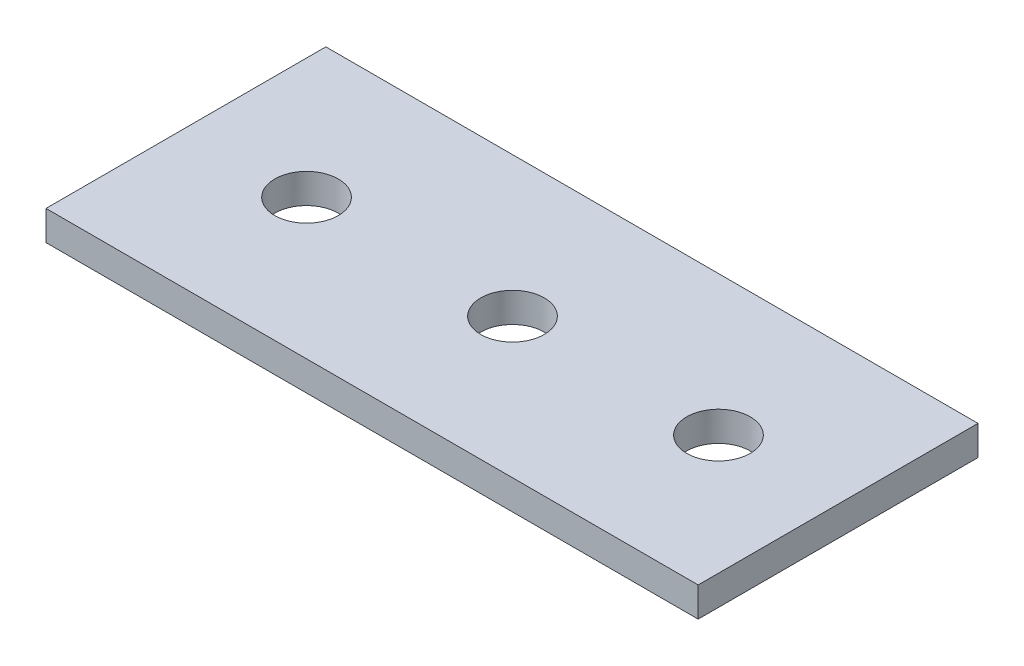
ISO-10303-21;
HEADER;
FILE_DESCRIPTION(('STEP AP214'),'2;1');
FILE_NAME('part.step','',(''),(''),'','','');
FILE_SCHEMA(('AUTOMOTIVE_DESIGN { 1 0 10303 214 1 1 1 1 }'));
ENDSEC;
DATA;
#1=APPLICATION_CONTEXT('core data for automotive mechanical design processes');
#2=APPLICATION_PROTOCOL_DEFINITION('international standard','automotive_design',2000,#1);
#3=PRODUCT_CONTEXT('',#1,'mechanical');
#4=PRODUCT('Part','Part','',(#3));
#5=PRODUCT_RELATED_PRODUCT_CATEGORY('part','',(#4));
#6=PRODUCT_DEFINITION_FORMATION('','',#4);
#7=PRODUCT_DEFINITION_CONTEXT('part definition',#1,'design');
#8=PRODUCT_DEFINITION('design','',#6,#7);
#9=PRODUCT_DEFINITION_SHAPE('','',#8);
#10=(LENGTH_UNIT() NAMED_UNIT(*) SI_UNIT(.MILLI.,.METRE.));
#11=(NAMED_UNIT(*) PLANE_ANGLE_UNIT() SI_UNIT($,.RADIAN.));
#12=(NAMED_UNIT(*) SI_UNIT($,.STERADIAN.) SOLID_ANGLE_UNIT());
#13=UNCERTAINTY_MEASURE_WITH_UNIT(LENGTH_MEASURE(1.E-05),#10,'distance_accuracy_value','');
#14=(GEOMETRIC_REPRESENTATION_CONTEXT(3) GLOBAL_UNCERTAINTY_ASSIGNED_CONTEXT((#13)) GLOBAL_UNIT_ASSIGNED_CONTEXT((#10,
#11,#12)) REPRESENTATION_CONTEXT('',''));
#15=CARTESIAN_POINT('',(0.,0.,0.));
#16=DIRECTION('',(0.,0.,1.));
#17=DIRECTION('',(1.,0.,0.));
#18=AXIS2_PLACEMENT_3D('',#15,#16,#17);
#19=CARTESIAN_POINT('',(0.,1.5875,0.));
#20=DIRECTION('',(1.,0.,0.));
#21=DIRECTION('',(0.,0.,-1.));
#22=AXIS2_PLACEMENT_3D('',#19,#20,#21);
#23=PLANE('',#22);
#24=DIRECTION('',(0.,0.,1.));
#25=VECTOR('',#24,1.);
#26=CARTESIAN_POINT('',(0.,0.,0.));
#27=LINE('',#26,#25);
#28=CARTESIAN_POINT('',(0.,0.,-14.986));
#29=VERTEX_POINT('',#28);
#30=CARTESIAN_POINT('',(0.,0.,0.));
#31=VERTEX_POINT('',#30);
#32=EDGE_CURVE('E80',#29,#31,#27,.T.);
#33=ORIENTED_EDGE('',*,*,#32,.T.);
#34=DIRECTION('',(0.,-1.,0.));
#35=VECTOR('',#34,1.);
#36=CARTESIAN_POINT('',(0.,1.5875,0.));
#37=LINE('',#36,#35);
#38=CARTESIAN_POINT('',(0.,1.5875,0.));
#39=VERTEX_POINT('',#38);
#40=EDGE_CURVE('E11',#39,#31,#37,.T.);
#41=ORIENTED_EDGE('',*,*,#40,.F.);
#42=DIRECTION('',(0.,0.,1.));
#43=VECTOR('',#42,1.);
#44=CARTESIAN_POINT('',(0.,1.5875,0.));
#45=LINE('',#44,#43);
#46=CARTESIAN_POINT('',(0.,1.5875,-14.986));
#47=VERTEX_POINT('',#46);
#48=EDGE_CURVE('E68',#47,#39,#45,.T.);
#49=ORIENTED_EDGE('',*,*,#48,.F.);
#50=DIRECTION('',(0.,-1.,0.));
#51=VECTOR('',#50,1.);
#52=CARTESIAN_POINT('',(0.,1.5875,-14.986));
#53=LINE('',#52,#51);
#54=EDGE_CURVE('E76',#47,#29,#53,.T.);
#55=ORIENTED_EDGE('',*,*,#54,.T.);
#56=EDGE_LOOP('',(#33,#41,#49,#55));
#57=FACE_BOUND('',#56,.T.);
#58=ADVANCED_FACE('F17',(#57),#23,.F.);
#59=CARTESIAN_POINT('',(0.,1.5875,0.));
#60=DIRECTION('',(0.,0.,-1.));
#61=DIRECTION('',(-1.,0.,0.));
#62=AXIS2_PLACEMENT_3D('',#59,#60,#61);
#63=PLANE('',#62);
#64=DIRECTION('',(1.,0.,0.));
#65=VECTOR('',#64,1.);
#66=CARTESIAN_POINT('',(0.,0.,0.));
#67=LINE('',#66,#65);
#68=CARTESIAN_POINT('',(34.925,0.,0.));
#69=VERTEX_POINT('',#68);
#70=EDGE_CURVE('E72',#31,#69,#67,.T.);
#71=ORIENTED_EDGE('',*,*,#70,.T.);
#72=DIRECTION('',(0.,-1.,0.));
#73=VECTOR('',#72,1.);
#74=CARTESIAN_POINT('',(34.925,1.5875,0.));
#75=LINE('',#74,#73);
#76=CARTESIAN_POINT('',(34.925,1.5875,0.));
#77=VERTEX_POINT('',#76);
#78=EDGE_CURVE('E25',#77,#69,#75,.T.);
#79=ORIENTED_EDGE('',*,*,#78,.F.);
#80=DIRECTION('',(1.,0.,0.));
#81=VECTOR('',#80,1.);
#82=CARTESIAN_POINT('',(0.,1.5875,0.));
#83=LINE('',#82,#81);
#84=EDGE_CURVE('E63',#39,#77,#83,.T.);
#85=ORIENTED_EDGE('',*,*,#84,.F.);
#86=ORIENTED_EDGE('',*,*,#40,.T.);
#87=EDGE_LOOP('',(#71,#79,#85,#86));
#88=FACE_BOUND('',#87,.T.);
#89=ADVANCED_FACE('F71',(#88),#63,.F.);
#90=CARTESIAN_POINT('',(34.925,1.5875,0.));
#91=DIRECTION('',(-1.,0.,0.));
#92=DIRECTION('',(0.,0.,1.));
#93=AXIS2_PLACEMENT_3D('',#90,#91,#92);
#94=PLANE('',#93);
#95=DIRECTION('',(0.,0.,-1.));
#96=VECTOR('',#95,1.);
#97=CARTESIAN_POINT('',(34.925,0.,0.));
#98=LINE('',#97,#96);
#99=CARTESIAN_POINT('',(34.925,0.,-14.986));
#100=VERTEX_POINT('',#99);
#101=EDGE_CURVE('E50',#69,#100,#98,.T.);
#102=ORIENTED_EDGE('',*,*,#101,.T.);
#103=DIRECTION('',(0.,-1.,0.));
#104=VECTOR('',#103,1.);
#105=CARTESIAN_POINT('',(34.925,1.5875,-14.986));
#106=LINE('',#105,#104);
#107=CARTESIAN_POINT('',(34.925,1.5875,-14.986));
#108=VERTEX_POINT('',#107);
#109=EDGE_CURVE('E73',#108,#100,#106,.T.);
#110=ORIENTED_EDGE('',*,*,#109,.F.);
#111=DIRECTION('',(0.,0.,-1.));
#112=VECTOR('',#111,1.);
#113=CARTESIAN_POINT('',(34.925,1.5875,0.));
#114=LINE('',#113,#112);
#115=EDGE_CURVE('E66',#77,#108,#114,.T.);
#116=ORIENTED_EDGE('',*,*,#115,.F.);
#117=ORIENTED_EDGE('',*,*,#78,.T.);
#118=EDGE_LOOP('',(#102,#110,#116,#117));
#119=FACE_BOUND('',#118,.T.);
#120=ADVANCED_FACE('F74',(#119),#94,.F.);
#121=CARTESIAN_POINT('',(0.,1.5875,-14.986));
#122=DIRECTION('',(0.,0.,1.));
#123=DIRECTION('',(1.,0.,0.));
#124=AXIS2_PLACEMENT_3D('',#121,#122,#123);
#125=PLANE('',#124);
#126=DIRECTION('',(-1.,0.,0.));
#127=VECTOR('',#126,1.);
#128=CARTESIAN_POINT('',(0.,0.,-14.986));
#129=LINE('',#128,#127);
#130=EDGE_CURVE('E56',#100,#29,#129,.T.);
#131=ORIENTED_EDGE('',*,*,#130,.T.);
#132=ORIENTED_EDGE('',*,*,#54,.F.);
#133=DIRECTION('',(-1.,0.,0.));
#134=VECTOR('',#133,1.);
#135=CARTESIAN_POINT('',(0.,1.5875,-14.986));
#136=LINE('',#135,#134);
#137=EDGE_CURVE('E33',#108,#47,#136,.T.);
#138=ORIENTED_EDGE('',*,*,#137,.F.);
#139=ORIENTED_EDGE('',*,*,#109,.T.);
#140=EDGE_LOOP('',(#131,#132,#138,#139));
#141=FACE_BOUND('',#140,.T.);
#142=ADVANCED_FACE('F88',(#141),#125,.F.);
#143=CARTESIAN_POINT('',(0.,1.5875,0.));
#144=DIRECTION('',(0.,-1.,0.));
#145=DIRECTION('',(0.,0.,-1.));
#146=AXIS2_PLACEMENT_3D('',#143,#144,#145);
#147=PLANE('',#146);
#148=CARTESIAN_POINT('',(6.46,1.5875,-7.493));
#149=DIRECTION('',(0.,1.,0.));
#150=DIRECTION('',(0.,0.,1.));
#151=AXIS2_PLACEMENT_3D('',#148,#149,#150);
#152=CIRCLE('',#151,1.7);
#153=CARTESIAN_POINT('',(6.46,1.5875,-5.793));
#154=VERTEX_POINT('',#153);
#155=EDGE_CURVE('E108',#154,#154,#152,.T.);
#156=ORIENTED_EDGE('',*,*,#155,.F.);
#157=EDGE_LOOP('',(#156));
#158=FACE_BOUND('',#157,.T.);
#159=CARTESIAN_POINT('',(17.49,1.5875,-7.493));
#160=DIRECTION('',(0.,1.,0.));
#161=DIRECTION('',(0.,0.,1.));
#162=AXIS2_PLACEMENT_3D('',#159,#160,#161);
#163=CIRCLE('',#162,1.7);
#164=CARTESIAN_POINT('',(17.49,1.5875,-5.793));
#165=VERTEX_POINT('',#164);
#166=EDGE_CURVE('E102',#165,#165,#163,.T.);
#167=ORIENTED_EDGE('',*,*,#166,.F.);
#168=EDGE_LOOP('',(#167));
#169=FACE_BOUND('',#168,.T.);
#170=CARTESIAN_POINT('',(28.52,1.5875,-7.493));
#171=DIRECTION('',(0.,1.,0.));
#172=DIRECTION('',(0.,0.,1.));
#173=AXIS2_PLACEMENT_3D('',#170,#171,#172);
#174=CIRCLE('',#173,1.7);
#175=CARTESIAN_POINT('',(28.52,1.5875,-5.793));
#176=VERTEX_POINT('',#175);
#177=EDGE_CURVE('E96',#176,#176,#174,.T.);
#178=ORIENTED_EDGE('',*,*,#177,.F.);
#179=EDGE_LOOP('',(#178));
#180=FACE_BOUND('',#179,.T.);
#181=ORIENTED_EDGE('',*,*,#48,.T.);
#182=ORIENTED_EDGE('',*,*,#84,.T.);
#183=ORIENTED_EDGE('',*,*,#115,.T.);
#184=ORIENTED_EDGE('',*,*,#137,.T.);
#185=EDGE_LOOP('',(#181,#182,#183,#184));
#186=FACE_BOUND('',#185,.T.);
#187=ADVANCED_FACE('F64',(#158,#169,#180,#186),#147,.F.);
#188=CARTESIAN_POINT('',(0.,0.,0.));
#189=DIRECTION('',(0.,-1.,0.));
#190=DIRECTION('',(0.,0.,-1.));
#191=AXIS2_PLACEMENT_3D('',#188,#189,#190);
#192=PLANE('',#191);
#193=CARTESIAN_POINT('',(6.46,0.,-7.493));
#194=DIRECTION('',(0.,-1.,0.));
#195=DIRECTION('',(0.,0.,-1.));
#196=AXIS2_PLACEMENT_3D('',#193,#194,#195);
#197=CIRCLE('',#196,1.7);
#198=CARTESIAN_POINT('',(6.46,0.,-9.193));
#199=VERTEX_POINT('',#198);
#200=EDGE_CURVE('E105',#199,#199,#197,.T.);
#201=ORIENTED_EDGE('',*,*,#200,.F.);
#202=EDGE_LOOP('',(#201));
#203=FACE_BOUND('',#202,.T.);
#204=CARTESIAN_POINT('',(17.49,0.,-7.493));
#205=DIRECTION('',(0.,-1.,0.));
#206=DIRECTION('',(0.,0.,-1.));
#207=AXIS2_PLACEMENT_3D('',#204,#205,#206);
#208=CIRCLE('',#207,1.7);
#209=CARTESIAN_POINT('',(17.49,0.,-9.193));
#210=VERTEX_POINT('',#209);
#211=EDGE_CURVE('E99',#210,#210,#208,.T.);
#212=ORIENTED_EDGE('',*,*,#211,.F.);
#213=EDGE_LOOP('',(#212));
#214=FACE_BOUND('',#213,.T.);
#215=CARTESIAN_POINT('',(28.52,0.,-7.493));
#216=DIRECTION('',(0.,-1.,0.));
#217=DIRECTION('',(0.,0.,-1.));
#218=AXIS2_PLACEMENT_3D('',#215,#216,#217);
#219=CIRCLE('',#218,1.7);
#220=CARTESIAN_POINT('',(28.52,0.,-9.193));
#221=VERTEX_POINT('',#220);
#222=EDGE_CURVE('E83',#221,#221,#219,.T.);
#223=ORIENTED_EDGE('',*,*,#222,.F.);
#224=EDGE_LOOP('',(#223));
#225=FACE_BOUND('',#224,.T.);
#226=ORIENTED_EDGE('',*,*,#32,.F.);
#227=ORIENTED_EDGE('',*,*,#130,.F.);
#228=ORIENTED_EDGE('',*,*,#101,.F.);
#229=ORIENTED_EDGE('',*,*,#70,.F.);
#230=EDGE_LOOP('',(#226,#227,#228,#229));
#231=FACE_BOUND('',#230,.T.);
#232=ADVANCED_FACE('F91',(#203,#214,#225,#231),#192,.T.);
#233=CARTESIAN_POINT('',(28.52,1.5875,-7.493));
#234=DIRECTION('',(0.,1.,0.));
#235=DIRECTION('',(0.,0.,1.));
#236=AXIS2_PLACEMENT_3D('',#233,#234,#235);
#237=CYLINDRICAL_SURFACE('',#236,1.7);
#238=ORIENTED_EDGE('',*,*,#222,.T.);
#239=EDGE_LOOP('',(#238));
#240=FACE_BOUND('',#239,.T.);
#241=ORIENTED_EDGE('',*,*,#177,.T.);
#242=EDGE_LOOP('',(#241));
#243=FACE_BOUND('',#242,.T.);
#244=ADVANCED_FACE('F121',(#240,#243),#237,.F.);
#245=CARTESIAN_POINT('',(17.49,1.5875,-7.493));
#246=DIRECTION('',(0.,1.,0.));
#247=DIRECTION('',(0.,0.,1.));
#248=AXIS2_PLACEMENT_3D('',#245,#246,#247);
#249=CYLINDRICAL_SURFACE('',#248,1.7);
#250=ORIENTED_EDGE('',*,*,#211,.T.);
#251=EDGE_LOOP('',(#250));
#252=FACE_BOUND('',#251,.T.);
#253=ORIENTED_EDGE('',*,*,#166,.T.);
#254=EDGE_LOOP('',(#253));
#255=FACE_BOUND('',#254,.T.);
#256=ADVANCED_FACE('F123',(#252,#255),#249,.F.);
#257=CARTESIAN_POINT('',(6.46,1.5875,-7.493));
#258=DIRECTION('',(0.,1.,0.));
#259=DIRECTION('',(0.,0.,1.));
#260=AXIS2_PLACEMENT_3D('',#257,#258,#259);
#261=CYLINDRICAL_SURFACE('',#260,1.7);
#262=ORIENTED_EDGE('',*,*,#200,.T.);
#263=EDGE_LOOP('',(#262));
#264=FACE_BOUND('',#263,.T.);
#265=ORIENTED_EDGE('',*,*,#155,.T.);
#266=EDGE_LOOP('',(#265));
#267=FACE_BOUND('',#266,.T.);
#268=ADVANCED_FACE('F112',(#264,#267),#261,.F.);
#269=CLOSED_SHELL('',(#58,#89,#120,#142,#187,#232,#244,#256,#268));
#270=MANIFOLD_SOLID_BREP('B1',#269);
#271=ADVANCED_BREP_SHAPE_REPRESENTATION('',(#18,#270),#14);
#272=SHAPE_DEFINITION_REPRESENTATION(#9,#271);
ENDSEC;
END-ISO-10303-21;
